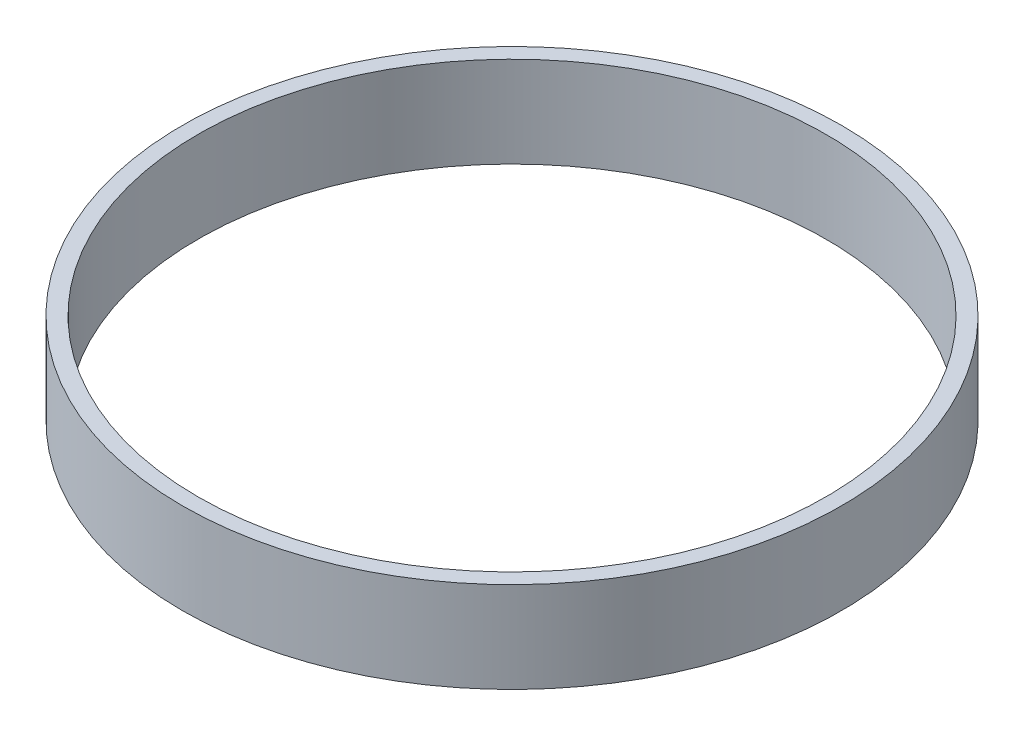
ISO-10303-21;
HEADER;
FILE_DESCRIPTION(('STEP AP214'),'2;1');
FILE_NAME('part.step','',(''),(''),'','','');
FILE_SCHEMA(('AUTOMOTIVE_DESIGN { 1 0 10303 214 1 1 1 1 }'));
ENDSEC;
DATA;
#1=APPLICATION_CONTEXT('core data for automotive mechanical design processes');
#2=APPLICATION_PROTOCOL_DEFINITION('international standard','automotive_design',2000,#1);
#3=PRODUCT_CONTEXT('',#1,'mechanical');
#4=PRODUCT('Part','Part','',(#3));
#5=PRODUCT_RELATED_PRODUCT_CATEGORY('part','',(#4));
#6=PRODUCT_DEFINITION_FORMATION('','',#4);
#7=PRODUCT_DEFINITION_CONTEXT('part definition',#1,'design');
#8=PRODUCT_DEFINITION('design','',#6,#7);
#9=PRODUCT_DEFINITION_SHAPE('','',#8);
#10=(LENGTH_UNIT() NAMED_UNIT(*) SI_UNIT(.MILLI.,.METRE.));
#11=(NAMED_UNIT(*) PLANE_ANGLE_UNIT() SI_UNIT($,.RADIAN.));
#12=(NAMED_UNIT(*) SI_UNIT($,.STERADIAN.) SOLID_ANGLE_UNIT());
#13=UNCERTAINTY_MEASURE_WITH_UNIT(LENGTH_MEASURE(1.E-05),#10,'distance_accuracy_value','');
#14=(GEOMETRIC_REPRESENTATION_CONTEXT(3) GLOBAL_UNCERTAINTY_ASSIGNED_CONTEXT((#13)) GLOBAL_UNIT_ASSIGNED_CONTEXT((#10,
#11,#12)) REPRESENTATION_CONTEXT('',''));
#15=CARTESIAN_POINT('',(0.,0.,0.));
#16=DIRECTION('',(0.,0.,1.));
#17=DIRECTION('',(1.,0.,0.));
#18=AXIS2_PLACEMENT_3D('',#15,#16,#17);
#19=CARTESIAN_POINT('',(0.,7.,0.));
#20=DIRECTION('',(0.,1.,0.));
#21=DIRECTION('',(0.,0.,1.));
#22=AXIS2_PLACEMENT_3D('',#19,#20,#21);
#23=PLANE('',#22);
#24=CARTESIAN_POINT('',(0.,7.,0.));
#25=DIRECTION('',(0.,1.,0.));
#26=DIRECTION('',(0.,0.,1.));
#27=AXIS2_PLACEMENT_3D('',#24,#25,#26);
#28=CIRCLE('',#27,25.405);
#29=CARTESIAN_POINT('',(0.,7.,25.405));
#30=VERTEX_POINT('',#29);
#31=EDGE_CURVE('E10',#30,#30,#28,.T.);
#32=ORIENTED_EDGE('',*,*,#31,.T.);
#33=EDGE_LOOP('',(#32));
#34=FACE_BOUND('',#33,.T.);
#35=CARTESIAN_POINT('',(0.,7.,0.));
#36=DIRECTION('',(0.,1.,0.));
#37=DIRECTION('',(0.,0.,1.));
#38=AXIS2_PLACEMENT_3D('',#35,#36,#37);
#39=CIRCLE('',#38,24.205);
#40=CARTESIAN_POINT('',(0.,7.,24.205));
#41=VERTEX_POINT('',#40);
#42=EDGE_CURVE('E56',#41,#41,#39,.T.);
#43=ORIENTED_EDGE('',*,*,#42,.F.);
#44=EDGE_LOOP('',(#43));
#45=FACE_BOUND('',#44,.T.);
#46=ADVANCED_FACE('F43',(#34,#45),#23,.T.);
#47=CARTESIAN_POINT('',(0.,0.,0.));
#48=DIRECTION('',(0.,1.,0.));
#49=DIRECTION('',(0.,0.,1.));
#50=AXIS2_PLACEMENT_3D('',#47,#48,#49);
#51=PLANE('',#50);
#52=CARTESIAN_POINT('',(0.,0.,0.));
#53=DIRECTION('',(0.,1.,0.));
#54=DIRECTION('',(0.,0.,1.));
#55=AXIS2_PLACEMENT_3D('',#52,#53,#54);
#56=CIRCLE('',#55,25.405);
#57=CARTESIAN_POINT('',(0.,0.,25.405));
#58=VERTEX_POINT('',#57);
#59=EDGE_CURVE('E47',#58,#58,#56,.T.);
#60=ORIENTED_EDGE('',*,*,#59,.F.);
#61=EDGE_LOOP('',(#60));
#62=FACE_BOUND('',#61,.T.);
#63=CARTESIAN_POINT('',(0.,0.,0.));
#64=DIRECTION('',(0.,1.,0.));
#65=DIRECTION('',(0.,0.,1.));
#66=AXIS2_PLACEMENT_3D('',#63,#64,#65);
#67=CIRCLE('',#66,24.205);
#68=CARTESIAN_POINT('',(0.,0.,24.205));
#69=VERTEX_POINT('',#68);
#70=EDGE_CURVE('E58',#69,#69,#67,.T.);
#71=ORIENTED_EDGE('',*,*,#70,.T.);
#72=EDGE_LOOP('',(#71));
#73=FACE_BOUND('',#72,.T.);
#74=ADVANCED_FACE('F70',(#62,#73),#51,.F.);
#75=CARTESIAN_POINT('',(0.,7.,0.));
#76=DIRECTION('',(0.,-1.,0.));
#77=DIRECTION('',(0.,0.,-1.));
#78=AXIS2_PLACEMENT_3D('',#75,#76,#77);
#79=CYLINDRICAL_SURFACE('',#78,25.405);
#80=ORIENTED_EDGE('',*,*,#31,.F.);
#81=EDGE_LOOP('',(#80));
#82=FACE_BOUND('',#81,.T.);
#83=ORIENTED_EDGE('',*,*,#59,.T.);
#84=EDGE_LOOP('',(#83));
#85=FACE_BOUND('',#84,.T.);
#86=ADVANCED_FACE('F45',(#82,#85),#79,.T.);
#87=CARTESIAN_POINT('',(0.,7.,0.));
#88=DIRECTION('',(0.,-1.,0.));
#89=DIRECTION('',(0.,0.,-1.));
#90=AXIS2_PLACEMENT_3D('',#87,#88,#89);
#91=CYLINDRICAL_SURFACE('',#90,24.205);
#92=ORIENTED_EDGE('',*,*,#42,.T.);
#93=EDGE_LOOP('',(#92));
#94=FACE_BOUND('',#93,.T.);
#95=ORIENTED_EDGE('',*,*,#70,.F.);
#96=EDGE_LOOP('',(#95));
#97=FACE_BOUND('',#96,.T.);
#98=ADVANCED_FACE('F66',(#94,#97),#91,.F.);
#99=CLOSED_SHELL('',(#46,#74,#86,#98));
#100=MANIFOLD_SOLID_BREP('B2',#99);
#101=ADVANCED_BREP_SHAPE_REPRESENTATION('',(#18,#100),#14);
#102=SHAPE_DEFINITION_REPRESENTATION(#9,#101);
ENDSEC;
END-ISO-10303-21;
